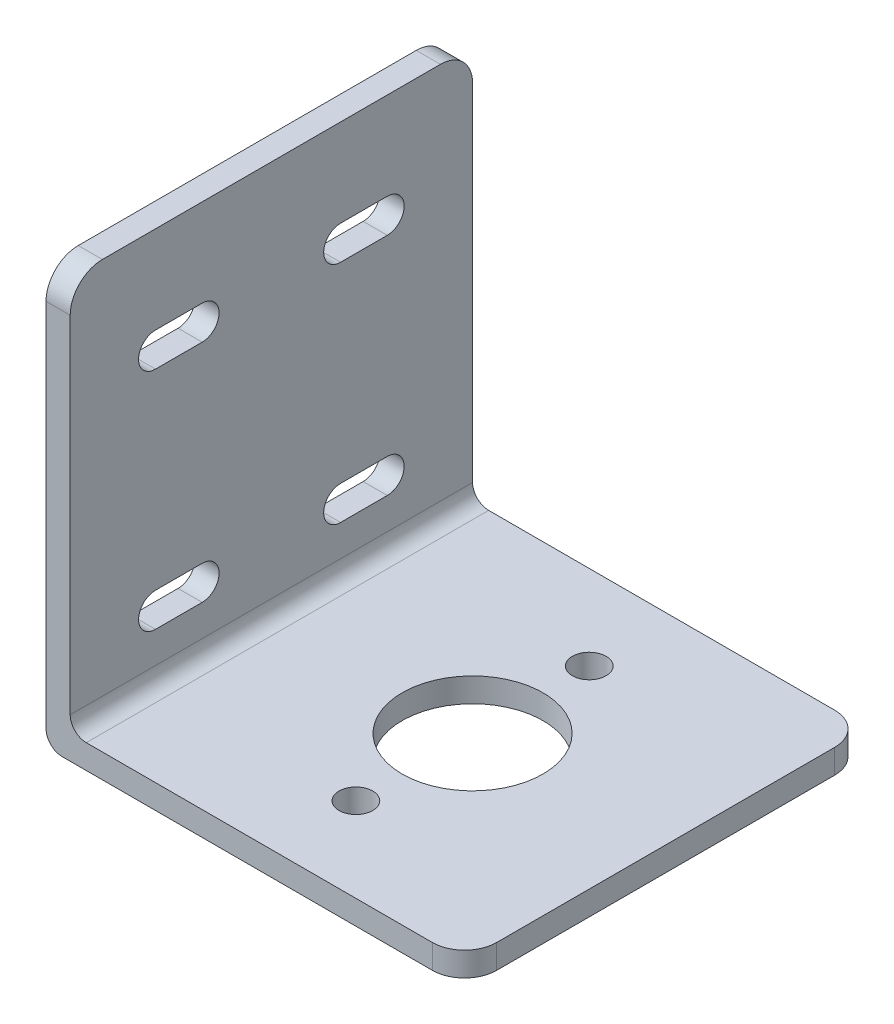
ISO-10303-21;
HEADER;
FILE_DESCRIPTION(('STEP AP214'),'2;1');
FILE_NAME('part.step','',(''),(''),'','','');
FILE_SCHEMA(('AUTOMOTIVE_DESIGN { 1 0 10303 214 1 1 1 1 }'));
ENDSEC;
DATA;
#1=APPLICATION_CONTEXT('core data for automotive mechanical design processes');
#2=APPLICATION_PROTOCOL_DEFINITION('international standard','automotive_design',2000,#1);
#3=PRODUCT_CONTEXT('',#1,'mechanical');
#4=PRODUCT('Part','Part','',(#3));
#5=PRODUCT_RELATED_PRODUCT_CATEGORY('part','',(#4));
#6=PRODUCT_DEFINITION_FORMATION('','',#4);
#7=PRODUCT_DEFINITION_CONTEXT('part definition',#1,'design');
#8=PRODUCT_DEFINITION('design','',#6,#7);
#9=PRODUCT_DEFINITION_SHAPE('','',#8);
#10=(LENGTH_UNIT() NAMED_UNIT(*) SI_UNIT(.MILLI.,.METRE.));
#11=(NAMED_UNIT(*) PLANE_ANGLE_UNIT() SI_UNIT($,.RADIAN.));
#12=(NAMED_UNIT(*) SI_UNIT($,.STERADIAN.) SOLID_ANGLE_UNIT());
#13=UNCERTAINTY_MEASURE_WITH_UNIT(LENGTH_MEASURE(1.E-05),#10,'distance_accuracy_value','');
#14=(GEOMETRIC_REPRESENTATION_CONTEXT(3) GLOBAL_UNCERTAINTY_ASSIGNED_CONTEXT((#13)) GLOBAL_UNIT_ASSIGNED_CONTEXT((#10,
#11,#12)) REPRESENTATION_CONTEXT('',''));
#15=CARTESIAN_POINT('',(0.,0.,0.));
#16=DIRECTION('',(0.,0.,1.));
#17=DIRECTION('',(1.,0.,0.));
#18=AXIS2_PLACEMENT_3D('',#15,#16,#17);
#19=CARTESIAN_POINT('',(0.,3.,0.));
#20=DIRECTION('',(0.,-1.,0.));
#21=DIRECTION('',(0.,0.,-1.));
#22=AXIS2_PLACEMENT_3D('',#19,#20,#21);
#23=PLANE('',#22);
#24=CARTESIAN_POINT('',(28.,3.,-25.));
#25=DIRECTION('',(0.,1.,0.));
#26=DIRECTION('',(0.,0.,1.));
#27=AXIS2_PLACEMENT_3D('',#24,#25,#26);
#28=CIRCLE('',#27,8.75);
#29=CARTESIAN_POINT('',(28.,3.,-16.25));
#30=VERTEX_POINT('',#29);
#31=EDGE_CURVE('E321',#30,#30,#28,.T.);
#32=ORIENTED_EDGE('',*,*,#31,.F.);
#33=EDGE_LOOP('',(#32));
#34=FACE_BOUND('',#33,.T.);
#35=CARTESIAN_POINT('',(28.,3.,-10.5));
#36=DIRECTION('',(0.,1.,0.));
#37=DIRECTION('',(0.,0.,1.));
#38=AXIS2_PLACEMENT_3D('',#35,#36,#37);
#39=CIRCLE('',#38,2.1);
#40=CARTESIAN_POINT('',(28.,3.,-8.4));
#41=VERTEX_POINT('',#40);
#42=EDGE_CURVE('E329',#41,#41,#39,.T.);
#43=ORIENTED_EDGE('',*,*,#42,.F.);
#44=EDGE_LOOP('',(#43));
#45=FACE_BOUND('',#44,.T.);
#46=CARTESIAN_POINT('',(28.,3.,-39.5));
#47=DIRECTION('',(0.,1.,0.));
#48=DIRECTION('',(0.,0.,1.));
#49=AXIS2_PLACEMENT_3D('',#46,#47,#48);
#50=CIRCLE('',#49,2.1);
#51=CARTESIAN_POINT('',(28.,3.,-37.4));
#52=VERTEX_POINT('',#51);
#53=EDGE_CURVE('E335',#52,#52,#50,.T.);
#54=ORIENTED_EDGE('',*,*,#53,.F.);
#55=EDGE_LOOP('',(#54));
#56=FACE_BOUND('',#55,.T.);
#57=DIRECTION('',(0.,0.,-1.));
#58=VECTOR('',#57,1.);
#59=CARTESIAN_POINT('',(52.,3.,0.));
#60=LINE('',#59,#58);
#61=CARTESIAN_POINT('',(52.,3.,-4.));
#62=VERTEX_POINT('',#61);
#63=CARTESIAN_POINT('',(52.,3.,-46.));
#64=VERTEX_POINT('',#63);
#65=EDGE_CURVE('E343',#62,#64,#60,.T.);
#66=ORIENTED_EDGE('',*,*,#65,.T.);
#67=CARTESIAN_POINT('',(48.,3.,-46.));
#68=DIRECTION('',(0.,-1.,0.));
#69=DIRECTION('',(0.,0.,-1.));
#70=AXIS2_PLACEMENT_3D('',#67,#68,#69);
#71=CIRCLE('',#70,4.);
#72=CARTESIAN_POINT('',(48.,3.,-50.));
#73=VERTEX_POINT('',#72);
#74=EDGE_CURVE('E11',#64,#73,#71,.F.);
#75=ORIENTED_EDGE('',*,*,#74,.T.);
#76=DIRECTION('',(-1.,0.,0.));
#77=VECTOR('',#76,1.);
#78=CARTESIAN_POINT('',(0.,3.,-50.));
#79=LINE('',#78,#77);
#80=CARTESIAN_POINT('',(5.,3.,-50.));
#81=VERTEX_POINT('',#80);
#82=EDGE_CURVE('E445',#73,#81,#79,.T.);
#83=ORIENTED_EDGE('',*,*,#82,.T.);
#84=DIRECTION('',(0.,0.,-1.));
#85=VECTOR('',#84,1.);
#86=CARTESIAN_POINT('',(5.00000000000001,3.,0.));
#87=LINE('',#86,#85);
#88=CARTESIAN_POINT('',(5.00000000000001,3.,0.));
#89=VERTEX_POINT('',#88);
#90=EDGE_CURVE('E353',#81,#89,#87,.F.);
#91=ORIENTED_EDGE('',*,*,#90,.T.);
#92=DIRECTION('',(1.,0.,0.));
#93=VECTOR('',#92,1.);
#94=CARTESIAN_POINT('',(0.,3.,0.));
#95=LINE('',#94,#93);
#96=CARTESIAN_POINT('',(48.,3.,0.));
#97=VERTEX_POINT('',#96);
#98=EDGE_CURVE('E346',#89,#97,#95,.T.);
#99=ORIENTED_EDGE('',*,*,#98,.T.);
#100=CARTESIAN_POINT('',(48.,3.,-4.));
#101=DIRECTION('',(0.,-1.,0.));
#102=DIRECTION('',(0.,0.,-1.));
#103=AXIS2_PLACEMENT_3D('',#100,#101,#102);
#104=CIRCLE('',#103,4.);
#105=EDGE_CURVE('E465',#97,#62,#104,.F.);
#106=ORIENTED_EDGE('',*,*,#105,.T.);
#107=EDGE_LOOP('',(#66,#75,#83,#91,#99,#106));
#108=FACE_BOUND('',#107,.T.);
#109=ADVANCED_FACE('F35',(#34,#45,#56,#108),#23,.F.);
#110=CARTESIAN_POINT('',(0.,0.,0.));
#111=DIRECTION('',(0.,-1.,0.));
#112=DIRECTION('',(0.,0.,-1.));
#113=AXIS2_PLACEMENT_3D('',#110,#111,#112);
#114=PLANE('',#113);
#115=CARTESIAN_POINT('',(28.,0.,-10.5));
#116=DIRECTION('',(0.,1.,0.));
#117=DIRECTION('',(0.,0.,1.));
#118=AXIS2_PLACEMENT_3D('',#115,#116,#117);
#119=CIRCLE('',#118,2.1);
#120=CARTESIAN_POINT('',(28.,0.,-8.4));
#121=VERTEX_POINT('',#120);
#122=EDGE_CURVE('E324',#121,#121,#119,.T.);
#123=ORIENTED_EDGE('',*,*,#122,.T.);
#124=EDGE_LOOP('',(#123));
#125=FACE_BOUND('',#124,.T.);
#126=DIRECTION('',(-1.,0.,0.));
#127=VECTOR('',#126,1.);
#128=CARTESIAN_POINT('',(0.,0.,-50.));
#129=LINE('',#128,#127);
#130=CARTESIAN_POINT('',(48.,0.,-50.));
#131=VERTEX_POINT('',#130);
#132=CARTESIAN_POINT('',(2.,0.,-50.));
#133=VERTEX_POINT('',#132);
#134=EDGE_CURVE('E350',#131,#133,#129,.T.);
#135=ORIENTED_EDGE('',*,*,#134,.F.);
#136=CARTESIAN_POINT('',(48.,0.,-46.));
#137=DIRECTION('',(0.,-1.,0.));
#138=DIRECTION('',(0.,0.,-1.));
#139=AXIS2_PLACEMENT_3D('',#136,#137,#138);
#140=CIRCLE('',#139,4.);
#141=CARTESIAN_POINT('',(52.,0.,-46.));
#142=VERTEX_POINT('',#141);
#143=EDGE_CURVE('E57',#131,#142,#140,.T.);
#144=ORIENTED_EDGE('',*,*,#143,.T.);
#145=DIRECTION('',(0.,0.,-1.));
#146=VECTOR('',#145,1.);
#147=CARTESIAN_POINT('',(52.,0.,0.));
#148=LINE('',#147,#146);
#149=CARTESIAN_POINT('',(52.,0.,-4.));
#150=VERTEX_POINT('',#149);
#151=EDGE_CURVE('E475',#150,#142,#148,.T.);
#152=ORIENTED_EDGE('',*,*,#151,.F.);
#153=CARTESIAN_POINT('',(48.,0.,-4.));
#154=DIRECTION('',(0.,-1.,0.));
#155=DIRECTION('',(0.,0.,-1.));
#156=AXIS2_PLACEMENT_3D('',#153,#154,#155);
#157=CIRCLE('',#156,4.);
#158=CARTESIAN_POINT('',(48.,0.,0.));
#159=VERTEX_POINT('',#158);
#160=EDGE_CURVE('E461',#150,#159,#157,.T.);
#161=ORIENTED_EDGE('',*,*,#160,.T.);
#162=DIRECTION('',(1.,0.,0.));
#163=VECTOR('',#162,1.);
#164=CARTESIAN_POINT('',(0.,0.,0.));
#165=LINE('',#164,#163);
#166=CARTESIAN_POINT('',(2.,0.,0.));
#167=VERTEX_POINT('',#166);
#168=EDGE_CURVE('E338',#167,#159,#165,.T.);
#169=ORIENTED_EDGE('',*,*,#168,.F.);
#170=DIRECTION('',(0.,0.,1.));
#171=VECTOR('',#170,1.);
#172=CARTESIAN_POINT('',(2.,0.,-50.));
#173=LINE('',#172,#171);
#174=EDGE_CURVE('E366',#167,#133,#173,.F.);
#175=ORIENTED_EDGE('',*,*,#174,.T.);
#176=EDGE_LOOP('',(#135,#144,#152,#161,#169,#175));
#177=FACE_BOUND('',#176,.T.);
#178=CARTESIAN_POINT('',(28.,0.,-39.5));
#179=DIRECTION('',(0.,1.,0.));
#180=DIRECTION('',(0.,0.,1.));
#181=AXIS2_PLACEMENT_3D('',#178,#179,#180);
#182=CIRCLE('',#181,2.1);
#183=CARTESIAN_POINT('',(28.,0.,-37.4));
#184=VERTEX_POINT('',#183);
#185=EDGE_CURVE('E332',#184,#184,#182,.T.);
#186=ORIENTED_EDGE('',*,*,#185,.T.);
#187=EDGE_LOOP('',(#186));
#188=FACE_BOUND('',#187,.T.);
#189=CARTESIAN_POINT('',(28.,0.,-25.));
#190=DIRECTION('',(0.,1.,0.));
#191=DIRECTION('',(0.,0.,1.));
#192=AXIS2_PLACEMENT_3D('',#189,#190,#191);
#193=CIRCLE('',#192,8.75);
#194=CARTESIAN_POINT('',(28.,0.,-16.25));
#195=VERTEX_POINT('',#194);
#196=EDGE_CURVE('E325',#195,#195,#193,.T.);
#197=ORIENTED_EDGE('',*,*,#196,.T.);
#198=EDGE_LOOP('',(#197));
#199=FACE_BOUND('',#198,.T.);
#200=ADVANCED_FACE('F494',(#125,#177,#188,#199),#114,.T.);
#201=CARTESIAN_POINT('',(0.,3.,0.));
#202=DIRECTION('',(1.,0.,0.));
#203=DIRECTION('',(0.,0.,-1.));
#204=AXIS2_PLACEMENT_3D('',#201,#202,#203);
#205=PLANE('',#204);
#206=DIRECTION('',(0.,0.,1.));
#207=VECTOR('',#206,1.);
#208=CARTESIAN_POINT('',(0.,36.9,-39.4000000000001));
#209=LINE('',#208,#207);
#210=CARTESIAN_POINT('',(0.,36.9,-39.4000000000001));
#211=VERTEX_POINT('',#210);
#212=CARTESIAN_POINT('',(0.,36.9,-33.6000000000001));
#213=VERTEX_POINT('',#212);
#214=EDGE_CURVE('E236',#211,#213,#209,.T.);
#215=ORIENTED_EDGE('',*,*,#214,.F.);
#216=CARTESIAN_POINT('',(0.,39.,-39.4000000000001));
#217=DIRECTION('',(-1.,0.,0.));
#218=DIRECTION('',(0.,0.,1.));
#219=AXIS2_PLACEMENT_3D('',#216,#217,#218);
#220=CIRCLE('',#219,2.1);
#221=CARTESIAN_POINT('',(0.,41.1,-39.4000000000001));
#222=VERTEX_POINT('',#221);
#223=EDGE_CURVE('E241',#222,#211,#220,.T.);
#224=ORIENTED_EDGE('',*,*,#223,.F.);
#225=DIRECTION('',(0.,0.,-1.));
#226=VECTOR('',#225,1.);
#227=CARTESIAN_POINT('',(0.,41.1,-39.4000000000001));
#228=LINE('',#227,#226);
#229=CARTESIAN_POINT('',(0.,41.1,-33.6000000000001));
#230=VERTEX_POINT('',#229);
#231=EDGE_CURVE('E246',#230,#222,#228,.T.);
#232=ORIENTED_EDGE('',*,*,#231,.F.);
#233=CARTESIAN_POINT('',(0.,39.,-33.6000000000001));
#234=DIRECTION('',(-1.,0.,0.));
#235=DIRECTION('',(0.,0.,1.));
#236=AXIS2_PLACEMENT_3D('',#233,#234,#235);
#237=CIRCLE('',#236,2.1);
#238=EDGE_CURVE('E225',#213,#230,#237,.T.);
#239=ORIENTED_EDGE('',*,*,#238,.F.);
#240=EDGE_LOOP('',(#215,#224,#232,#239));
#241=FACE_BOUND('',#240,.T.);
#242=DIRECTION('',(0.,0.,1.));
#243=VECTOR('',#242,1.);
#244=CARTESIAN_POINT('',(0.,36.9,-16.4000000000001));
#245=LINE('',#244,#243);
#246=CARTESIAN_POINT('',(0.,36.9,-16.4000000000001));
#247=VERTEX_POINT('',#246);
#248=CARTESIAN_POINT('',(0.,36.9,-10.6000000000001));
#249=VERTEX_POINT('',#248);
#250=EDGE_CURVE('E257',#247,#249,#245,.T.);
#251=ORIENTED_EDGE('',*,*,#250,.F.);
#252=CARTESIAN_POINT('',(0.,39.,-16.4000000000001));
#253=DIRECTION('',(-1.,0.,0.));
#254=DIRECTION('',(0.,0.,1.));
#255=AXIS2_PLACEMENT_3D('',#252,#253,#254);
#256=CIRCLE('',#255,2.1);
#257=CARTESIAN_POINT('',(0.,41.1,-16.4000000000001));
#258=VERTEX_POINT('',#257);
#259=EDGE_CURVE('E253',#258,#247,#256,.T.);
#260=ORIENTED_EDGE('',*,*,#259,.F.);
#261=DIRECTION('',(0.,0.,-1.));
#262=VECTOR('',#261,1.);
#263=CARTESIAN_POINT('',(0.,41.1,-16.4000000000001));
#264=LINE('',#263,#262);
#265=CARTESIAN_POINT('',(0.,41.1,-10.6000000000001));
#266=VERTEX_POINT('',#265);
#267=EDGE_CURVE('E263',#266,#258,#264,.T.);
#268=ORIENTED_EDGE('',*,*,#267,.F.);
#269=CARTESIAN_POINT('',(0.,39.,-10.6000000000001));
#270=DIRECTION('',(-1.,0.,0.));
#271=DIRECTION('',(0.,0.,1.));
#272=AXIS2_PLACEMENT_3D('',#269,#270,#271);
#273=CIRCLE('',#272,2.1);
#274=EDGE_CURVE('E260',#249,#266,#273,.T.);
#275=ORIENTED_EDGE('',*,*,#274,.F.);
#276=EDGE_LOOP('',(#251,#260,#268,#275));
#277=FACE_BOUND('',#276,.T.);
#278=DIRECTION('',(0.,0.,1.));
#279=VECTOR('',#278,1.);
#280=CARTESIAN_POINT('',(0.,8.90000000000001,-16.4));
#281=LINE('',#280,#279);
#282=CARTESIAN_POINT('',(0.,8.90000000000001,-16.4));
#283=VERTEX_POINT('',#282);
#284=CARTESIAN_POINT('',(0.,8.9,-10.6));
#285=VERTEX_POINT('',#284);
#286=EDGE_CURVE('E277',#283,#285,#281,.T.);
#287=ORIENTED_EDGE('',*,*,#286,.F.);
#288=CARTESIAN_POINT('',(0.,11.,-16.4));
#289=DIRECTION('',(-1.,0.,0.));
#290=DIRECTION('',(0.,0.,1.));
#291=AXIS2_PLACEMENT_3D('',#288,#289,#290);
#292=CIRCLE('',#291,2.1);
#293=CARTESIAN_POINT('',(0.,13.1,-16.4));
#294=VERTEX_POINT('',#293);
#295=EDGE_CURVE('E269',#294,#283,#292,.T.);
#296=ORIENTED_EDGE('',*,*,#295,.F.);
#297=DIRECTION('',(0.,0.,-1.));
#298=VECTOR('',#297,1.);
#299=CARTESIAN_POINT('',(0.,13.1,-16.4));
#300=LINE('',#299,#298);
#301=CARTESIAN_POINT('',(0.,13.1,-10.6));
#302=VERTEX_POINT('',#301);
#303=EDGE_CURVE('E283',#302,#294,#300,.T.);
#304=ORIENTED_EDGE('',*,*,#303,.F.);
#305=CARTESIAN_POINT('',(0.,11.,-10.6));
#306=DIRECTION('',(-1.,0.,0.));
#307=DIRECTION('',(0.,0.,1.));
#308=AXIS2_PLACEMENT_3D('',#305,#306,#307);
#309=CIRCLE('',#308,2.1);
#310=EDGE_CURVE('E280',#285,#302,#309,.T.);
#311=ORIENTED_EDGE('',*,*,#310,.F.);
#312=EDGE_LOOP('',(#287,#296,#304,#311));
#313=FACE_BOUND('',#312,.T.);
#314=DIRECTION('',(0.,0.,1.));
#315=VECTOR('',#314,1.);
#316=CARTESIAN_POINT('',(0.,8.90000000000001,-39.4));
#317=LINE('',#316,#315);
#318=CARTESIAN_POINT('',(0.,8.90000000000001,-39.4));
#319=VERTEX_POINT('',#318);
#320=CARTESIAN_POINT('',(0.,8.9,-33.6));
#321=VERTEX_POINT('',#320);
#322=EDGE_CURVE('E297',#319,#321,#317,.T.);
#323=ORIENTED_EDGE('',*,*,#322,.F.);
#324=CARTESIAN_POINT('',(0.,11.,-39.4));
#325=DIRECTION('',(-1.,0.,0.));
#326=DIRECTION('',(0.,0.,1.));
#327=AXIS2_PLACEMENT_3D('',#324,#325,#326);
#328=CIRCLE('',#327,2.1);
#329=CARTESIAN_POINT('',(0.,13.1,-39.4));
#330=VERTEX_POINT('',#329);
#331=EDGE_CURVE('E289',#330,#319,#328,.T.);
#332=ORIENTED_EDGE('',*,*,#331,.F.);
#333=DIRECTION('',(0.,0.,-1.));
#334=VECTOR('',#333,1.);
#335=CARTESIAN_POINT('',(0.,13.1,-39.4));
#336=LINE('',#335,#334);
#337=CARTESIAN_POINT('',(0.,13.1,-33.6));
#338=VERTEX_POINT('',#337);
#339=EDGE_CURVE('E303',#338,#330,#336,.T.);
#340=ORIENTED_EDGE('',*,*,#339,.F.);
#341=CARTESIAN_POINT('',(0.,11.,-33.6));
#342=DIRECTION('',(-1.,0.,0.));
#343=DIRECTION('',(0.,0.,1.));
#344=AXIS2_PLACEMENT_3D('',#341,#342,#343);
#345=CIRCLE('',#344,2.1);
#346=EDGE_CURVE('E300',#321,#338,#345,.T.);
#347=ORIENTED_EDGE('',*,*,#346,.F.);
#348=EDGE_LOOP('',(#323,#332,#340,#347));
#349=FACE_BOUND('',#348,.T.);
#350=DIRECTION('',(0.,0.,1.));
#351=VECTOR('',#350,1.);
#352=CARTESIAN_POINT('',(0.,52.,-50.));
#353=LINE('',#352,#351);
#354=CARTESIAN_POINT('',(0.,52.,-46.));
#355=VERTEX_POINT('',#354);
#356=CARTESIAN_POINT('',(0.,52.,-4.));
#357=VERTEX_POINT('',#356);
#358=EDGE_CURVE('E309',#355,#357,#353,.T.);
#359=ORIENTED_EDGE('',*,*,#358,.F.);
#360=CARTESIAN_POINT('',(0.,48.,-46.));
#361=DIRECTION('',(1.,0.,0.));
#362=DIRECTION('',(0.,0.,-1.));
#363=AXIS2_PLACEMENT_3D('',#360,#361,#362);
#364=CIRCLE('',#363,4.);
#365=CARTESIAN_POINT('',(0.,48.,-50.));
#366=VERTEX_POINT('',#365);
#367=EDGE_CURVE('E453',#355,#366,#364,.F.);
#368=ORIENTED_EDGE('',*,*,#367,.T.);
#369=DIRECTION('',(0.,-1.,0.));
#370=VECTOR('',#369,1.);
#371=CARTESIAN_POINT('',(0.,3.,-50.));
#372=LINE('',#371,#370);
#373=CARTESIAN_POINT('',(0.,2.,-50.));
#374=VERTEX_POINT('',#373);
#375=EDGE_CURVE('E469',#366,#374,#372,.T.);
#376=ORIENTED_EDGE('',*,*,#375,.T.);
#377=DIRECTION('',(0.,0.,1.));
#378=VECTOR('',#377,1.);
#379=CARTESIAN_POINT('',(0.,2.,0.));
#380=LINE('',#379,#378);
#381=CARTESIAN_POINT('',(0.,2.,0.));
#382=VERTEX_POINT('',#381);
#383=EDGE_CURVE('E361',#374,#382,#380,.T.);
#384=ORIENTED_EDGE('',*,*,#383,.T.);
#385=DIRECTION('',(0.,-1.,0.));
#386=VECTOR('',#385,1.);
#387=CARTESIAN_POINT('',(0.,3.,0.));
#388=LINE('',#387,#386);
#389=CARTESIAN_POINT('',(0.,48.,0.));
#390=VERTEX_POINT('',#389);
#391=EDGE_CURVE('E388',#390,#382,#388,.T.);
#392=ORIENTED_EDGE('',*,*,#391,.F.);
#393=CARTESIAN_POINT('',(0.,48.,-4.));
#394=DIRECTION('',(1.,0.,0.));
#395=DIRECTION('',(0.,0.,-1.));
#396=AXIS2_PLACEMENT_3D('',#393,#394,#395);
#397=CIRCLE('',#396,4.);
#398=EDGE_CURVE('E509',#390,#357,#397,.F.);
#399=ORIENTED_EDGE('',*,*,#398,.T.);
#400=EDGE_LOOP('',(#359,#368,#376,#384,#392,#399));
#401=FACE_BOUND('',#400,.T.);
#402=ADVANCED_FACE('F243',(#241,#277,#313,#349,#401),#205,.F.);
#403=CARTESIAN_POINT('',(0.,3.,0.));
#404=DIRECTION('',(0.,0.,-1.));
#405=DIRECTION('',(-1.,0.,0.));
#406=AXIS2_PLACEMENT_3D('',#403,#404,#405);
#407=PLANE('',#406);
#408=ORIENTED_EDGE('',*,*,#168,.T.);
#409=DIRECTION('',(0.,-1.,0.));
#410=VECTOR('',#409,1.);
#411=CARTESIAN_POINT('',(48.,3.,0.));
#412=LINE('',#411,#410);
#413=EDGE_CURVE('E463',#159,#97,#412,.F.);
#414=ORIENTED_EDGE('',*,*,#413,.T.);
#415=ORIENTED_EDGE('',*,*,#98,.F.);
#416=CARTESIAN_POINT('',(5.00000000000001,5.,0.));
#417=DIRECTION('',(0.,0.,-1.));
#418=DIRECTION('',(-1.,0.,0.));
#419=AXIS2_PLACEMENT_3D('',#416,#417,#418);
#420=CIRCLE('',#419,2.);
#421=CARTESIAN_POINT('',(3.00000000000001,5.,0.));
#422=VERTEX_POINT('',#421);
#423=EDGE_CURVE('E358',#89,#422,#420,.T.);
#424=ORIENTED_EDGE('',*,*,#423,.T.);
#425=DIRECTION('',(0.,-1.,0.));
#426=VECTOR('',#425,1.);
#427=CARTESIAN_POINT('',(3.00000000000001,52.,0.));
#428=LINE('',#427,#426);
#429=CARTESIAN_POINT('',(3.00000000000001,48.,0.));
#430=VERTEX_POINT('',#429);
#431=EDGE_CURVE('E328',#430,#422,#428,.T.);
#432=ORIENTED_EDGE('',*,*,#431,.F.);
#433=DIRECTION('',(1.,0.,0.));
#434=VECTOR('',#433,1.);
#435=CARTESIAN_POINT('',(0.,48.,0.));
#436=LINE('',#435,#434);
#437=EDGE_CURVE('E484',#430,#390,#436,.F.);
#438=ORIENTED_EDGE('',*,*,#437,.T.);
#439=ORIENTED_EDGE('',*,*,#391,.T.);
#440=CARTESIAN_POINT('',(2.,2.,0.));
#441=DIRECTION('',(0.,0.,-1.));
#442=DIRECTION('',(-1.,0.,0.));
#443=AXIS2_PLACEMENT_3D('',#440,#441,#442);
#444=CIRCLE('',#443,2.);
#445=EDGE_CURVE('E364',#382,#167,#444,.F.);
#446=ORIENTED_EDGE('',*,*,#445,.T.);
#447=EDGE_LOOP('',(#408,#414,#415,#424,#432,#438,#439,#446));
#448=FACE_BOUND('',#447,.T.);
#449=ADVANCED_FACE('F481',(#448),#407,.F.);
#450=CARTESIAN_POINT('',(52.,3.,0.));
#451=DIRECTION('',(-1.,0.,0.));
#452=DIRECTION('',(0.,0.,1.));
#453=AXIS2_PLACEMENT_3D('',#450,#451,#452);
#454=PLANE('',#453);
#455=ORIENTED_EDGE('',*,*,#151,.T.);
#456=DIRECTION('',(0.,-1.,0.));
#457=VECTOR('',#456,1.);
#458=CARTESIAN_POINT('',(52.,3.,-46.));
#459=LINE('',#458,#457);
#460=EDGE_CURVE('E43',#142,#64,#459,.F.);
#461=ORIENTED_EDGE('',*,*,#460,.T.);
#462=ORIENTED_EDGE('',*,*,#65,.F.);
#463=DIRECTION('',(0.,-1.,0.));
#464=VECTOR('',#463,1.);
#465=CARTESIAN_POINT('',(52.,3.,-4.));
#466=LINE('',#465,#464);
#467=EDGE_CURVE('E458',#62,#150,#466,.T.);
#468=ORIENTED_EDGE('',*,*,#467,.T.);
#469=EDGE_LOOP('',(#455,#461,#462,#468));
#470=FACE_BOUND('',#469,.T.);
#471=ADVANCED_FACE('F504',(#470),#454,.F.);
#472=CARTESIAN_POINT('',(0.,3.,-50.));
#473=DIRECTION('',(0.,0.,1.));
#474=DIRECTION('',(1.,0.,0.));
#475=AXIS2_PLACEMENT_3D('',#472,#473,#474);
#476=PLANE('',#475);
#477=ORIENTED_EDGE('',*,*,#82,.F.);
#478=DIRECTION('',(0.,-1.,0.));
#479=VECTOR('',#478,1.);
#480=CARTESIAN_POINT('',(48.,3.,-50.));
#481=LINE('',#480,#479);
#482=EDGE_CURVE('E467',#73,#131,#481,.T.);
#483=ORIENTED_EDGE('',*,*,#482,.T.);
#484=ORIENTED_EDGE('',*,*,#134,.T.);
#485=CARTESIAN_POINT('',(2.,2.,-50.));
#486=DIRECTION('',(0.,0.,1.));
#487=DIRECTION('',(1.,0.,0.));
#488=AXIS2_PLACEMENT_3D('',#485,#486,#487);
#489=CIRCLE('',#488,2.);
#490=EDGE_CURVE('E369',#133,#374,#489,.F.);
#491=ORIENTED_EDGE('',*,*,#490,.T.);
#492=ORIENTED_EDGE('',*,*,#375,.F.);
#493=DIRECTION('',(-1.,0.,0.));
#494=VECTOR('',#493,1.);
#495=CARTESIAN_POINT('',(3.,48.,-50.));
#496=LINE('',#495,#494);
#497=CARTESIAN_POINT('',(3.,48.,-50.));
#498=VERTEX_POINT('',#497);
#499=EDGE_CURVE('E449',#366,#498,#496,.F.);
#500=ORIENTED_EDGE('',*,*,#499,.T.);
#501=DIRECTION('',(0.,-1.,0.));
#502=VECTOR('',#501,1.);
#503=CARTESIAN_POINT('',(3.,52.,-50.));
#504=LINE('',#503,#502);
#505=CARTESIAN_POINT('',(3.,5.,-50.));
#506=VERTEX_POINT('',#505);
#507=EDGE_CURVE('E320',#498,#506,#504,.T.);
#508=ORIENTED_EDGE('',*,*,#507,.T.);
#509=CARTESIAN_POINT('',(5.,5.,-50.));
#510=DIRECTION('',(0.,0.,1.));
#511=DIRECTION('',(1.,0.,0.));
#512=AXIS2_PLACEMENT_3D('',#509,#510,#511);
#513=CIRCLE('',#512,2.);
#514=EDGE_CURVE('E355',#506,#81,#513,.T.);
#515=ORIENTED_EDGE('',*,*,#514,.T.);
#516=EDGE_LOOP('',(#477,#483,#484,#491,#492,#500,#508,#515));
#517=FACE_BOUND('',#516,.T.);
#518=ADVANCED_FACE('F443',(#517),#476,.F.);
#519=CARTESIAN_POINT('',(28.,3.,-39.5));
#520=DIRECTION('',(0.,-1.,0.));
#521=DIRECTION('',(0.,0.,-1.));
#522=AXIS2_PLACEMENT_3D('',#519,#520,#521);
#523=CYLINDRICAL_SURFACE('',#522,2.1);
#524=ORIENTED_EDGE('',*,*,#53,.T.);
#525=EDGE_LOOP('',(#524));
#526=FACE_BOUND('',#525,.T.);
#527=ORIENTED_EDGE('',*,*,#185,.F.);
#528=EDGE_LOOP('',(#527));
#529=FACE_BOUND('',#528,.T.);
#530=ADVANCED_FACE('F537',(#526,#529),#523,.F.);
#531=CARTESIAN_POINT('',(28.,3.,-10.5));
#532=DIRECTION('',(0.,-1.,0.));
#533=DIRECTION('',(0.,0.,-1.));
#534=AXIS2_PLACEMENT_3D('',#531,#532,#533);
#535=CYLINDRICAL_SURFACE('',#534,2.1);
#536=ORIENTED_EDGE('',*,*,#42,.T.);
#537=EDGE_LOOP('',(#536));
#538=FACE_BOUND('',#537,.T.);
#539=ORIENTED_EDGE('',*,*,#122,.F.);
#540=EDGE_LOOP('',(#539));
#541=FACE_BOUND('',#540,.T.);
#542=ADVANCED_FACE('F644',(#538,#541),#535,.F.);
#543=CARTESIAN_POINT('',(28.,3.,-25.));
#544=DIRECTION('',(0.,-1.,0.));
#545=DIRECTION('',(0.,0.,-1.));
#546=AXIS2_PLACEMENT_3D('',#543,#544,#545);
#547=CYLINDRICAL_SURFACE('',#546,8.75);
#548=ORIENTED_EDGE('',*,*,#31,.T.);
#549=EDGE_LOOP('',(#548));
#550=FACE_BOUND('',#549,.T.);
#551=ORIENTED_EDGE('',*,*,#196,.F.);
#552=EDGE_LOOP('',(#551));
#553=FACE_BOUND('',#552,.T.);
#554=ADVANCED_FACE('F579',(#550,#553),#547,.F.);
#555=CARTESIAN_POINT('',(3.,52.,-50.));
#556=DIRECTION('',(-1.,0.,0.));
#557=DIRECTION('',(0.,0.,1.));
#558=AXIS2_PLACEMENT_3D('',#555,#556,#557);
#559=PLANE('',#558);
#560=DIRECTION('',(0.,0.,-1.));
#561=VECTOR('',#560,1.);
#562=CARTESIAN_POINT('',(3.,41.1,-50.));
#563=LINE('',#562,#561);
#564=CARTESIAN_POINT('',(3.,41.1,-33.6000000000001));
#565=VERTEX_POINT('',#564);
#566=CARTESIAN_POINT('',(3.,41.1,-39.4000000000001));
#567=VERTEX_POINT('',#566);
#568=EDGE_CURVE('E424',#565,#567,#563,.T.);
#569=ORIENTED_EDGE('',*,*,#568,.T.);
#570=CARTESIAN_POINT('',(3.,39.,-39.4000000000001));
#571=DIRECTION('',(-1.,0.,0.));
#572=DIRECTION('',(0.,0.,1.));
#573=AXIS2_PLACEMENT_3D('',#570,#571,#572);
#574=CIRCLE('',#573,2.1);
#575=CARTESIAN_POINT('',(3.,36.9,-39.4000000000001));
#576=VERTEX_POINT('',#575);
#577=EDGE_CURVE('E426',#567,#576,#574,.T.);
#578=ORIENTED_EDGE('',*,*,#577,.T.);
#579=DIRECTION('',(0.,0.,1.));
#580=VECTOR('',#579,1.);
#581=CARTESIAN_POINT('',(3.,36.9,-50.));
#582=LINE('',#581,#580);
#583=CARTESIAN_POINT('',(3.,36.9,-33.6000000000001));
#584=VERTEX_POINT('',#583);
#585=EDGE_CURVE('E421',#576,#584,#582,.T.);
#586=ORIENTED_EDGE('',*,*,#585,.T.);
#587=CARTESIAN_POINT('',(3.,39.,-33.6000000000001));
#588=DIRECTION('',(-1.,0.,0.));
#589=DIRECTION('',(0.,0.,1.));
#590=AXIS2_PLACEMENT_3D('',#587,#588,#589);
#591=CIRCLE('',#590,2.1);
#592=EDGE_CURVE('E228',#584,#565,#591,.T.);
#593=ORIENTED_EDGE('',*,*,#592,.T.);
#594=EDGE_LOOP('',(#569,#578,#586,#593));
#595=FACE_BOUND('',#594,.T.);
#596=DIRECTION('',(0.,0.,-1.));
#597=VECTOR('',#596,1.);
#598=CARTESIAN_POINT('',(3.,41.1,-50.));
#599=LINE('',#598,#597);
#600=CARTESIAN_POINT('',(3.00000000000001,41.1,-10.6000000000001));
#601=VERTEX_POINT('',#600);
#602=CARTESIAN_POINT('',(3.,41.1,-16.4000000000001));
#603=VERTEX_POINT('',#602);
#604=EDGE_CURVE('E415',#601,#603,#599,.T.);
#605=ORIENTED_EDGE('',*,*,#604,.T.);
#606=CARTESIAN_POINT('',(3.,39.,-16.4000000000001));
#607=DIRECTION('',(-1.,0.,0.));
#608=DIRECTION('',(0.,0.,1.));
#609=AXIS2_PLACEMENT_3D('',#606,#607,#608);
#610=CIRCLE('',#609,2.1);
#611=CARTESIAN_POINT('',(3.,36.9,-16.4000000000001));
#612=VERTEX_POINT('',#611);
#613=EDGE_CURVE('E418',#603,#612,#610,.T.);
#614=ORIENTED_EDGE('',*,*,#613,.T.);
#615=DIRECTION('',(0.,0.,1.));
#616=VECTOR('',#615,1.);
#617=CARTESIAN_POINT('',(3.,36.9,-50.));
#618=LINE('',#617,#616);
#619=CARTESIAN_POINT('',(3.00000000000001,36.9,-10.6000000000001));
#620=VERTEX_POINT('',#619);
#621=EDGE_CURVE('E409',#612,#620,#618,.T.);
#622=ORIENTED_EDGE('',*,*,#621,.T.);
#623=CARTESIAN_POINT('',(3.00000000000001,39.,-10.6000000000001));
#624=DIRECTION('',(-1.,0.,0.));
#625=DIRECTION('',(0.,0.,1.));
#626=AXIS2_PLACEMENT_3D('',#623,#624,#625);
#627=CIRCLE('',#626,2.1);
#628=EDGE_CURVE('E412',#620,#601,#627,.T.);
#629=ORIENTED_EDGE('',*,*,#628,.T.);
#630=EDGE_LOOP('',(#605,#614,#622,#629));
#631=FACE_BOUND('',#630,.T.);
#632=DIRECTION('',(0.,0.,-1.));
#633=VECTOR('',#632,1.);
#634=CARTESIAN_POINT('',(3.,13.1,-50.));
#635=LINE('',#634,#633);
#636=CARTESIAN_POINT('',(3.00000000000001,13.1,-10.6));
#637=VERTEX_POINT('',#636);
#638=CARTESIAN_POINT('',(3.,13.1,-16.4));
#639=VERTEX_POINT('',#638);
#640=EDGE_CURVE('E403',#637,#639,#635,.T.);
#641=ORIENTED_EDGE('',*,*,#640,.T.);
#642=CARTESIAN_POINT('',(3.,11.,-16.4));
#643=DIRECTION('',(-1.,0.,0.));
#644=DIRECTION('',(0.,0.,1.));
#645=AXIS2_PLACEMENT_3D('',#642,#643,#644);
#646=CIRCLE('',#645,2.1);
#647=CARTESIAN_POINT('',(3.,8.90000000000001,-16.4));
#648=VERTEX_POINT('',#647);
#649=EDGE_CURVE('E406',#639,#648,#646,.T.);
#650=ORIENTED_EDGE('',*,*,#649,.T.);
#651=DIRECTION('',(0.,0.,1.));
#652=VECTOR('',#651,1.);
#653=CARTESIAN_POINT('',(3.,8.90000000000001,-50.));
#654=LINE('',#653,#652);
#655=CARTESIAN_POINT('',(3.00000000000001,8.9,-10.6));
#656=VERTEX_POINT('',#655);
#657=EDGE_CURVE('E397',#648,#656,#654,.T.);
#658=ORIENTED_EDGE('',*,*,#657,.T.);
#659=CARTESIAN_POINT('',(3.00000000000001,11.,-10.6));
#660=DIRECTION('',(-1.,0.,0.));
#661=DIRECTION('',(0.,0.,1.));
#662=AXIS2_PLACEMENT_3D('',#659,#660,#661);
#663=CIRCLE('',#662,2.1);
#664=EDGE_CURVE('E400',#656,#637,#663,.T.);
#665=ORIENTED_EDGE('',*,*,#664,.T.);
#666=EDGE_LOOP('',(#641,#650,#658,#665));
#667=FACE_BOUND('',#666,.T.);
#668=DIRECTION('',(0.,0.,-1.));
#669=VECTOR('',#668,1.);
#670=CARTESIAN_POINT('',(3.,13.1,-50.));
#671=LINE('',#670,#669);
#672=CARTESIAN_POINT('',(3.,13.1,-33.6));
#673=VERTEX_POINT('',#672);
#674=CARTESIAN_POINT('',(3.,13.1,-39.4));
#675=VERTEX_POINT('',#674);
#676=EDGE_CURVE('E391',#673,#675,#671,.T.);
#677=ORIENTED_EDGE('',*,*,#676,.T.);
#678=CARTESIAN_POINT('',(3.,11.,-39.4));
#679=DIRECTION('',(-1.,0.,0.));
#680=DIRECTION('',(0.,0.,1.));
#681=AXIS2_PLACEMENT_3D('',#678,#679,#680);
#682=CIRCLE('',#681,2.1);
#683=CARTESIAN_POINT('',(3.,8.90000000000001,-39.4));
#684=VERTEX_POINT('',#683);
#685=EDGE_CURVE('E394',#675,#684,#682,.T.);
#686=ORIENTED_EDGE('',*,*,#685,.T.);
#687=DIRECTION('',(0.,0.,1.));
#688=VECTOR('',#687,1.);
#689=CARTESIAN_POINT('',(3.,8.90000000000001,-50.));
#690=LINE('',#689,#688);
#691=CARTESIAN_POINT('',(3.,8.9,-33.6));
#692=VERTEX_POINT('',#691);
#693=EDGE_CURVE('E384',#684,#692,#690,.T.);
#694=ORIENTED_EDGE('',*,*,#693,.T.);
#695=CARTESIAN_POINT('',(3.,11.,-33.6));
#696=DIRECTION('',(-1.,0.,0.));
#697=DIRECTION('',(0.,0.,1.));
#698=AXIS2_PLACEMENT_3D('',#695,#696,#697);
#699=CIRCLE('',#698,2.1);
#700=EDGE_CURVE('E387',#692,#673,#699,.T.);
#701=ORIENTED_EDGE('',*,*,#700,.T.);
#702=EDGE_LOOP('',(#677,#686,#694,#701));
#703=FACE_BOUND('',#702,.T.);
#704=ORIENTED_EDGE('',*,*,#507,.F.);
#705=CARTESIAN_POINT('',(3.,48.,-46.));
#706=DIRECTION('',(-1.,0.,0.));
#707=DIRECTION('',(0.,0.,1.));
#708=AXIS2_PLACEMENT_3D('',#705,#706,#707);
#709=CIRCLE('',#708,4.);
#710=CARTESIAN_POINT('',(3.,52.,-46.));
#711=VERTEX_POINT('',#710);
#712=EDGE_CURVE('E456',#498,#711,#709,.F.);
#713=ORIENTED_EDGE('',*,*,#712,.T.);
#714=DIRECTION('',(0.,0.,-1.));
#715=VECTOR('',#714,1.);
#716=CARTESIAN_POINT('',(3.,52.,-50.));
#717=LINE('',#716,#715);
#718=CARTESIAN_POINT('',(3.00000000000001,52.,-4.));
#719=VERTEX_POINT('',#718);
#720=EDGE_CURVE('E317',#719,#711,#717,.T.);
#721=ORIENTED_EDGE('',*,*,#720,.F.);
#722=CARTESIAN_POINT('',(3.00000000000001,48.,-4.));
#723=DIRECTION('',(-1.,0.,0.));
#724=DIRECTION('',(0.,0.,1.));
#725=AXIS2_PLACEMENT_3D('',#722,#723,#724);
#726=CIRCLE('',#725,4.);
#727=EDGE_CURVE('E375',#719,#430,#726,.F.);
#728=ORIENTED_EDGE('',*,*,#727,.T.);
#729=ORIENTED_EDGE('',*,*,#431,.T.);
#730=DIRECTION('',(0.,0.,-1.));
#731=VECTOR('',#730,1.);
#732=CARTESIAN_POINT('',(3.,5.,-50.));
#733=LINE('',#732,#731);
#734=EDGE_CURVE('E351',#422,#506,#733,.T.);
#735=ORIENTED_EDGE('',*,*,#734,.T.);
#736=EDGE_LOOP('',(#704,#713,#721,#728,#729,#735));
#737=FACE_BOUND('',#736,.T.);
#738=ADVANCED_FACE('F433',(#595,#631,#667,#703,#737),#559,.F.);
#739=CARTESIAN_POINT('',(0.,52.,0.));
#740=DIRECTION('',(0.,1.,0.));
#741=DIRECTION('',(0.,0.,1.));
#742=AXIS2_PLACEMENT_3D('',#739,#740,#741);
#743=PLANE('',#742);
#744=ORIENTED_EDGE('',*,*,#720,.T.);
#745=DIRECTION('',(-1.,0.,0.));
#746=VECTOR('',#745,1.);
#747=CARTESIAN_POINT('',(0.,52.,-46.));
#748=LINE('',#747,#746);
#749=EDGE_CURVE('E510',#711,#355,#748,.T.);
#750=ORIENTED_EDGE('',*,*,#749,.T.);
#751=ORIENTED_EDGE('',*,*,#358,.T.);
#752=DIRECTION('',(1.,0.,0.));
#753=VECTOR('',#752,1.);
#754=CARTESIAN_POINT('',(3.00000000000001,52.,-4.));
#755=LINE('',#754,#753);
#756=EDGE_CURVE('E372',#357,#719,#755,.T.);
#757=ORIENTED_EDGE('',*,*,#756,.T.);
#758=EDGE_LOOP('',(#744,#750,#751,#757));
#759=FACE_BOUND('',#758,.T.);
#760=ADVANCED_FACE('F515',(#759),#743,.T.);
#761=CARTESIAN_POINT('',(4.,11.,-39.4));
#762=DIRECTION('',(-1.,0.,0.));
#763=DIRECTION('',(0.,0.,1.));
#764=AXIS2_PLACEMENT_3D('',#761,#762,#763);
#765=CYLINDRICAL_SURFACE('',#764,2.1);
#766=DIRECTION('',(-1.,0.,0.));
#767=VECTOR('',#766,1.);
#768=CARTESIAN_POINT('',(4.,13.1,-39.4));
#769=LINE('',#768,#767);
#770=EDGE_CURVE('E307',#675,#330,#769,.T.);
#771=ORIENTED_EDGE('',*,*,#770,.T.);
#772=ORIENTED_EDGE('',*,*,#331,.T.);
#773=DIRECTION('',(-1.,0.,0.));
#774=VECTOR('',#773,1.);
#775=CARTESIAN_POINT('',(4.,8.90000000000001,-39.4));
#776=LINE('',#775,#774);
#777=EDGE_CURVE('E306',#684,#319,#776,.T.);
#778=ORIENTED_EDGE('',*,*,#777,.F.);
#779=ORIENTED_EDGE('',*,*,#685,.F.);
#780=EDGE_LOOP('',(#771,#772,#778,#779));
#781=FACE_BOUND('',#780,.T.);
#782=ADVANCED_FACE('F589',(#781),#765,.F.);
#783=CARTESIAN_POINT('',(4.,13.1,-39.4));
#784=DIRECTION('',(0.,1.,0.));
#785=DIRECTION('',(0.,0.,1.));
#786=AXIS2_PLACEMENT_3D('',#783,#784,#785);
#787=PLANE('',#786);
#788=DIRECTION('',(-1.,0.,0.));
#789=VECTOR('',#788,1.);
#790=CARTESIAN_POINT('',(4.,13.1,-33.6));
#791=LINE('',#790,#789);
#792=EDGE_CURVE('E310',#673,#338,#791,.T.);
#793=ORIENTED_EDGE('',*,*,#792,.T.);
#794=ORIENTED_EDGE('',*,*,#339,.T.);
#795=ORIENTED_EDGE('',*,*,#770,.F.);
#796=ORIENTED_EDGE('',*,*,#676,.F.);
#797=EDGE_LOOP('',(#793,#794,#795,#796));
#798=FACE_BOUND('',#797,.T.);
#799=ADVANCED_FACE('F663',(#798),#787,.F.);
#800=CARTESIAN_POINT('',(4.,11.,-33.6));
#801=DIRECTION('',(-1.,0.,0.));
#802=DIRECTION('',(0.,0.,1.));
#803=AXIS2_PLACEMENT_3D('',#800,#801,#802);
#804=CYLINDRICAL_SURFACE('',#803,2.1);
#805=DIRECTION('',(-1.,0.,0.));
#806=VECTOR('',#805,1.);
#807=CARTESIAN_POINT('',(4.,8.9,-33.6));
#808=LINE('',#807,#806);
#809=EDGE_CURVE('E312',#692,#321,#808,.T.);
#810=ORIENTED_EDGE('',*,*,#809,.T.);
#811=ORIENTED_EDGE('',*,*,#346,.T.);
#812=ORIENTED_EDGE('',*,*,#792,.F.);
#813=ORIENTED_EDGE('',*,*,#700,.F.);
#814=EDGE_LOOP('',(#810,#811,#812,#813));
#815=FACE_BOUND('',#814,.T.);
#816=ADVANCED_FACE('F673',(#815),#804,.F.);
#817=CARTESIAN_POINT('',(4.,8.90000000000001,-39.4));
#818=DIRECTION('',(0.,-1.,0.));
#819=DIRECTION('',(0.,0.,-1.));
#820=AXIS2_PLACEMENT_3D('',#817,#818,#819);
#821=PLANE('',#820);
#822=ORIENTED_EDGE('',*,*,#777,.T.);
#823=ORIENTED_EDGE('',*,*,#322,.T.);
#824=ORIENTED_EDGE('',*,*,#809,.F.);
#825=ORIENTED_EDGE('',*,*,#693,.F.);
#826=EDGE_LOOP('',(#822,#823,#824,#825));
#827=FACE_BOUND('',#826,.T.);
#828=ADVANCED_FACE('F683',(#827),#821,.F.);
#829=CARTESIAN_POINT('',(4.,11.,-16.4));
#830=DIRECTION('',(-1.,0.,0.));
#831=DIRECTION('',(0.,0.,1.));
#832=AXIS2_PLACEMENT_3D('',#829,#830,#831);
#833=CYLINDRICAL_SURFACE('',#832,2.1);
#834=DIRECTION('',(-1.,0.,0.));
#835=VECTOR('',#834,1.);
#836=CARTESIAN_POINT('',(4.,13.1,-16.4));
#837=LINE('',#836,#835);
#838=EDGE_CURVE('E287',#639,#294,#837,.T.);
#839=ORIENTED_EDGE('',*,*,#838,.T.);
#840=ORIENTED_EDGE('',*,*,#295,.T.);
#841=DIRECTION('',(-1.,0.,0.));
#842=VECTOR('',#841,1.);
#843=CARTESIAN_POINT('',(4.,8.90000000000001,-16.4));
#844=LINE('',#843,#842);
#845=EDGE_CURVE('E286',#648,#283,#844,.T.);
#846=ORIENTED_EDGE('',*,*,#845,.F.);
#847=ORIENTED_EDGE('',*,*,#649,.F.);
#848=EDGE_LOOP('',(#839,#840,#846,#847));
#849=FACE_BOUND('',#848,.T.);
#850=ADVANCED_FACE('F693',(#849),#833,.F.);
#851=CARTESIAN_POINT('',(4.,13.1,-16.4));
#852=DIRECTION('',(0.,1.,0.));
#853=DIRECTION('',(0.,0.,1.));
#854=AXIS2_PLACEMENT_3D('',#851,#852,#853);
#855=PLANE('',#854);
#856=DIRECTION('',(-1.,0.,0.));
#857=VECTOR('',#856,1.);
#858=CARTESIAN_POINT('',(4.,13.1,-10.6));
#859=LINE('',#858,#857);
#860=EDGE_CURVE('E290',#637,#302,#859,.T.);
#861=ORIENTED_EDGE('',*,*,#860,.T.);
#862=ORIENTED_EDGE('',*,*,#303,.T.);
#863=ORIENTED_EDGE('',*,*,#838,.F.);
#864=ORIENTED_EDGE('',*,*,#640,.F.);
#865=EDGE_LOOP('',(#861,#862,#863,#864));
#866=FACE_BOUND('',#865,.T.);
#867=ADVANCED_FACE('F703',(#866),#855,.F.);
#868=CARTESIAN_POINT('',(4.,11.,-10.6));
#869=DIRECTION('',(-1.,0.,0.));
#870=DIRECTION('',(0.,0.,1.));
#871=AXIS2_PLACEMENT_3D('',#868,#869,#870);
#872=CYLINDRICAL_SURFACE('',#871,2.1);
#873=DIRECTION('',(-1.,0.,0.));
#874=VECTOR('',#873,1.);
#875=CARTESIAN_POINT('',(4.,8.9,-10.6));
#876=LINE('',#875,#874);
#877=EDGE_CURVE('E292',#656,#285,#876,.T.);
#878=ORIENTED_EDGE('',*,*,#877,.T.);
#879=ORIENTED_EDGE('',*,*,#310,.T.);
#880=ORIENTED_EDGE('',*,*,#860,.F.);
#881=ORIENTED_EDGE('',*,*,#664,.F.);
#882=EDGE_LOOP('',(#878,#879,#880,#881));
#883=FACE_BOUND('',#882,.T.);
#884=ADVANCED_FACE('F713',(#883),#872,.F.);
#885=CARTESIAN_POINT('',(4.,8.90000000000001,-16.4));
#886=DIRECTION('',(0.,-1.,0.));
#887=DIRECTION('',(0.,0.,-1.));
#888=AXIS2_PLACEMENT_3D('',#885,#886,#887);
#889=PLANE('',#888);
#890=ORIENTED_EDGE('',*,*,#845,.T.);
#891=ORIENTED_EDGE('',*,*,#286,.T.);
#892=ORIENTED_EDGE('',*,*,#877,.F.);
#893=ORIENTED_EDGE('',*,*,#657,.F.);
#894=EDGE_LOOP('',(#890,#891,#892,#893));
#895=FACE_BOUND('',#894,.T.);
#896=ADVANCED_FACE('F723',(#895),#889,.F.);
#897=CARTESIAN_POINT('',(4.,39.,-16.4000000000001));
#898=DIRECTION('',(-1.,0.,0.));
#899=DIRECTION('',(0.,0.,1.));
#900=AXIS2_PLACEMENT_3D('',#897,#898,#899);
#901=CYLINDRICAL_SURFACE('',#900,2.1);
#902=DIRECTION('',(-1.,0.,0.));
#903=VECTOR('',#902,1.);
#904=CARTESIAN_POINT('',(4.,41.1,-16.4000000000001));
#905=LINE('',#904,#903);
#906=EDGE_CURVE('E267',#603,#258,#905,.T.);
#907=ORIENTED_EDGE('',*,*,#906,.T.);
#908=ORIENTED_EDGE('',*,*,#259,.T.);
#909=DIRECTION('',(-1.,0.,0.));
#910=VECTOR('',#909,1.);
#911=CARTESIAN_POINT('',(4.,36.9,-16.4000000000001));
#912=LINE('',#911,#910);
#913=EDGE_CURVE('E266',#612,#247,#912,.T.);
#914=ORIENTED_EDGE('',*,*,#913,.F.);
#915=ORIENTED_EDGE('',*,*,#613,.F.);
#916=EDGE_LOOP('',(#907,#908,#914,#915));
#917=FACE_BOUND('',#916,.T.);
#918=ADVANCED_FACE('F733',(#917),#901,.F.);
#919=CARTESIAN_POINT('',(4.,41.1,-16.4000000000001));
#920=DIRECTION('',(0.,1.,0.));
#921=DIRECTION('',(0.,0.,1.));
#922=AXIS2_PLACEMENT_3D('',#919,#920,#921);
#923=PLANE('',#922);
#924=DIRECTION('',(-1.,0.,0.));
#925=VECTOR('',#924,1.);
#926=CARTESIAN_POINT('',(4.,41.1,-10.6000000000001));
#927=LINE('',#926,#925);
#928=EDGE_CURVE('E270',#601,#266,#927,.T.);
#929=ORIENTED_EDGE('',*,*,#928,.T.);
#930=ORIENTED_EDGE('',*,*,#267,.T.);
#931=ORIENTED_EDGE('',*,*,#906,.F.);
#932=ORIENTED_EDGE('',*,*,#604,.F.);
#933=EDGE_LOOP('',(#929,#930,#931,#932));
#934=FACE_BOUND('',#933,.T.);
#935=ADVANCED_FACE('F743',(#934),#923,.F.);
#936=CARTESIAN_POINT('',(4.,39.,-10.6000000000001));
#937=DIRECTION('',(-1.,0.,0.));
#938=DIRECTION('',(0.,0.,1.));
#939=AXIS2_PLACEMENT_3D('',#936,#937,#938);
#940=CYLINDRICAL_SURFACE('',#939,2.1);
#941=DIRECTION('',(-1.,0.,0.));
#942=VECTOR('',#941,1.);
#943=CARTESIAN_POINT('',(4.,36.9,-10.6000000000001));
#944=LINE('',#943,#942);
#945=EDGE_CURVE('E272',#620,#249,#944,.T.);
#946=ORIENTED_EDGE('',*,*,#945,.T.);
#947=ORIENTED_EDGE('',*,*,#274,.T.);
#948=ORIENTED_EDGE('',*,*,#928,.F.);
#949=ORIENTED_EDGE('',*,*,#628,.F.);
#950=EDGE_LOOP('',(#946,#947,#948,#949));
#951=FACE_BOUND('',#950,.T.);
#952=ADVANCED_FACE('F753',(#951),#940,.F.);
#953=CARTESIAN_POINT('',(4.,36.9,-16.4000000000001));
#954=DIRECTION('',(0.,-1.,0.));
#955=DIRECTION('',(0.,0.,-1.));
#956=AXIS2_PLACEMENT_3D('',#953,#954,#955);
#957=PLANE('',#956);
#958=ORIENTED_EDGE('',*,*,#913,.T.);
#959=ORIENTED_EDGE('',*,*,#250,.T.);
#960=ORIENTED_EDGE('',*,*,#945,.F.);
#961=ORIENTED_EDGE('',*,*,#621,.F.);
#962=EDGE_LOOP('',(#958,#959,#960,#961));
#963=FACE_BOUND('',#962,.T.);
#964=ADVANCED_FACE('F763',(#963),#957,.F.);
#965=CARTESIAN_POINT('',(4.,39.,-39.4000000000001));
#966=DIRECTION('',(-1.,0.,0.));
#967=DIRECTION('',(0.,0.,1.));
#968=AXIS2_PLACEMENT_3D('',#965,#966,#967);
#969=CYLINDRICAL_SURFACE('',#968,2.1);
#970=DIRECTION('',(-1.,0.,0.));
#971=VECTOR('',#970,1.);
#972=CARTESIAN_POINT('',(4.,41.1,-39.4000000000001));
#973=LINE('',#972,#971);
#974=EDGE_CURVE('E251',#567,#222,#973,.T.);
#975=ORIENTED_EDGE('',*,*,#974,.T.);
#976=ORIENTED_EDGE('',*,*,#223,.T.);
#977=DIRECTION('',(-1.,0.,0.));
#978=VECTOR('',#977,1.);
#979=CARTESIAN_POINT('',(4.,36.9,-39.4000000000001));
#980=LINE('',#979,#978);
#981=EDGE_CURVE('E232',#576,#211,#980,.T.);
#982=ORIENTED_EDGE('',*,*,#981,.F.);
#983=ORIENTED_EDGE('',*,*,#577,.F.);
#984=EDGE_LOOP('',(#975,#976,#982,#983));
#985=FACE_BOUND('',#984,.T.);
#986=ADVANCED_FACE('F773',(#985),#969,.F.);
#987=CARTESIAN_POINT('',(4.,41.1,-39.4000000000001));
#988=DIRECTION('',(0.,1.,0.));
#989=DIRECTION('',(0.,0.,1.));
#990=AXIS2_PLACEMENT_3D('',#987,#988,#989);
#991=PLANE('',#990);
#992=DIRECTION('',(-1.,0.,0.));
#993=VECTOR('',#992,1.);
#994=CARTESIAN_POINT('',(4.,41.1,-33.6000000000001));
#995=LINE('',#994,#993);
#996=EDGE_CURVE('E231',#565,#230,#995,.T.);
#997=ORIENTED_EDGE('',*,*,#996,.T.);
#998=ORIENTED_EDGE('',*,*,#231,.T.);
#999=ORIENTED_EDGE('',*,*,#974,.F.);
#1000=ORIENTED_EDGE('',*,*,#568,.F.);
#1001=EDGE_LOOP('',(#997,#998,#999,#1000));
#1002=FACE_BOUND('',#1001,.T.);
#1003=ADVANCED_FACE('F783',(#1002),#991,.F.);
#1004=CARTESIAN_POINT('',(4.,39.,-33.6000000000001));
#1005=DIRECTION('',(-1.,0.,0.));
#1006=DIRECTION('',(0.,0.,1.));
#1007=AXIS2_PLACEMENT_3D('',#1004,#1005,#1006);
#1008=CYLINDRICAL_SURFACE('',#1007,2.1);
#1009=DIRECTION('',(-1.,0.,0.));
#1010=VECTOR('',#1009,1.);
#1011=CARTESIAN_POINT('',(4.,36.9,-33.6000000000001));
#1012=LINE('',#1011,#1010);
#1013=EDGE_CURVE('E220',#584,#213,#1012,.T.);
#1014=ORIENTED_EDGE('',*,*,#1013,.T.);
#1015=ORIENTED_EDGE('',*,*,#238,.T.);
#1016=ORIENTED_EDGE('',*,*,#996,.F.);
#1017=ORIENTED_EDGE('',*,*,#592,.F.);
#1018=EDGE_LOOP('',(#1014,#1015,#1016,#1017));
#1019=FACE_BOUND('',#1018,.T.);
#1020=ADVANCED_FACE('F222',(#1019),#1008,.F.);
#1021=CARTESIAN_POINT('',(4.,36.9,-39.4000000000001));
#1022=DIRECTION('',(0.,-1.,0.));
#1023=DIRECTION('',(0.,0.,-1.));
#1024=AXIS2_PLACEMENT_3D('',#1021,#1022,#1023);
#1025=PLANE('',#1024);
#1026=ORIENTED_EDGE('',*,*,#981,.T.);
#1027=ORIENTED_EDGE('',*,*,#214,.T.);
#1028=ORIENTED_EDGE('',*,*,#1013,.F.);
#1029=ORIENTED_EDGE('',*,*,#585,.F.);
#1030=EDGE_LOOP('',(#1026,#1027,#1028,#1029));
#1031=FACE_BOUND('',#1030,.T.);
#1032=ADVANCED_FACE('F237',(#1031),#1025,.F.);
#1033=CARTESIAN_POINT('',(5.,5.,-50.));
#1034=DIRECTION('',(0.,0.,1.));
#1035=DIRECTION('',(1.,0.,0.));
#1036=AXIS2_PLACEMENT_3D('',#1033,#1034,#1035);
#1037=CYLINDRICAL_SURFACE('',#1036,2.);
#1038=ORIENTED_EDGE('',*,*,#423,.F.);
#1039=ORIENTED_EDGE('',*,*,#90,.F.);
#1040=ORIENTED_EDGE('',*,*,#514,.F.);
#1041=ORIENTED_EDGE('',*,*,#734,.F.);
#1042=EDGE_LOOP('',(#1038,#1039,#1040,#1041));
#1043=FACE_BOUND('',#1042,.T.);
#1044=ADVANCED_FACE('F439',(#1043),#1037,.F.);
#1045=CARTESIAN_POINT('',(2.,2.,0.));
#1046=DIRECTION('',(0.,0.,-1.));
#1047=DIRECTION('',(-1.,0.,0.));
#1048=AXIS2_PLACEMENT_3D('',#1045,#1046,#1047);
#1049=CYLINDRICAL_SURFACE('',#1048,2.);
#1050=ORIENTED_EDGE('',*,*,#490,.F.);
#1051=ORIENTED_EDGE('',*,*,#174,.F.);
#1052=ORIENTED_EDGE('',*,*,#445,.F.);
#1053=ORIENTED_EDGE('',*,*,#383,.F.);
#1054=EDGE_LOOP('',(#1050,#1051,#1052,#1053));
#1055=FACE_BOUND('',#1054,.T.);
#1056=ADVANCED_FACE('F492',(#1055),#1049,.T.);
#1057=CARTESIAN_POINT('',(0.,48.,-4.));
#1058=DIRECTION('',(-1.,0.,0.));
#1059=DIRECTION('',(0.,0.,1.));
#1060=AXIS2_PLACEMENT_3D('',#1057,#1058,#1059);
#1061=CYLINDRICAL_SURFACE('',#1060,4.);
#1062=ORIENTED_EDGE('',*,*,#398,.F.);
#1063=ORIENTED_EDGE('',*,*,#437,.F.);
#1064=ORIENTED_EDGE('',*,*,#727,.F.);
#1065=ORIENTED_EDGE('',*,*,#756,.F.);
#1066=EDGE_LOOP('',(#1062,#1063,#1064,#1065));
#1067=FACE_BOUND('',#1066,.T.);
#1068=ADVANCED_FACE('F507',(#1067),#1061,.T.);
#1069=CARTESIAN_POINT('',(0.,48.,-46.));
#1070=DIRECTION('',(1.,0.,0.));
#1071=DIRECTION('',(0.,0.,-1.));
#1072=AXIS2_PLACEMENT_3D('',#1069,#1070,#1071);
#1073=CYLINDRICAL_SURFACE('',#1072,4.);
#1074=ORIENTED_EDGE('',*,*,#712,.F.);
#1075=ORIENTED_EDGE('',*,*,#499,.F.);
#1076=ORIENTED_EDGE('',*,*,#367,.F.);
#1077=ORIENTED_EDGE('',*,*,#749,.F.);
#1078=EDGE_LOOP('',(#1074,#1075,#1076,#1077));
#1079=FACE_BOUND('',#1078,.T.);
#1080=ADVANCED_FACE('F518',(#1079),#1073,.T.);
#1081=CARTESIAN_POINT('',(48.,3.,-4.));
#1082=DIRECTION('',(0.,-1.,0.));
#1083=DIRECTION('',(0.,0.,-1.));
#1084=AXIS2_PLACEMENT_3D('',#1081,#1082,#1083);
#1085=CYLINDRICAL_SURFACE('',#1084,4.);
#1086=ORIENTED_EDGE('',*,*,#105,.F.);
#1087=ORIENTED_EDGE('',*,*,#413,.F.);
#1088=ORIENTED_EDGE('',*,*,#160,.F.);
#1089=ORIENTED_EDGE('',*,*,#467,.F.);
#1090=EDGE_LOOP('',(#1086,#1087,#1088,#1089));
#1091=FACE_BOUND('',#1090,.T.);
#1092=ADVANCED_FACE('F500',(#1091),#1085,.T.);
#1093=CARTESIAN_POINT('',(48.,3.,-46.));
#1094=DIRECTION('',(0.,-1.,0.));
#1095=DIRECTION('',(0.,0.,-1.));
#1096=AXIS2_PLACEMENT_3D('',#1093,#1094,#1095);
#1097=CYLINDRICAL_SURFACE('',#1096,4.);
#1098=ORIENTED_EDGE('',*,*,#74,.F.);
#1099=ORIENTED_EDGE('',*,*,#460,.F.);
#1100=ORIENTED_EDGE('',*,*,#143,.F.);
#1101=ORIENTED_EDGE('',*,*,#482,.F.);
#1102=EDGE_LOOP('',(#1098,#1099,#1100,#1101));
#1103=FACE_BOUND('',#1102,.T.);
#1104=ADVANCED_FACE('F37',(#1103),#1097,.T.);
#1105=CLOSED_SHELL('',(#109,#200,#402,#449,#471,#518,#530,#542,#554,#738,#760,#782,#799,#816,
#828,#850,#867,#884,#896,#918,#935,#952,#964,#986,#1003,#1020,#1032,#1044,#1056,#1068,#1080,
#1092,#1104));
#1106=MANIFOLD_SOLID_BREP('B2',#1105);
#1107=ADVANCED_BREP_SHAPE_REPRESENTATION('',(#18,#1106),#14);
#1108=SHAPE_DEFINITION_REPRESENTATION(#9,#1107);
ENDSEC;
END-ISO-10303-21;
